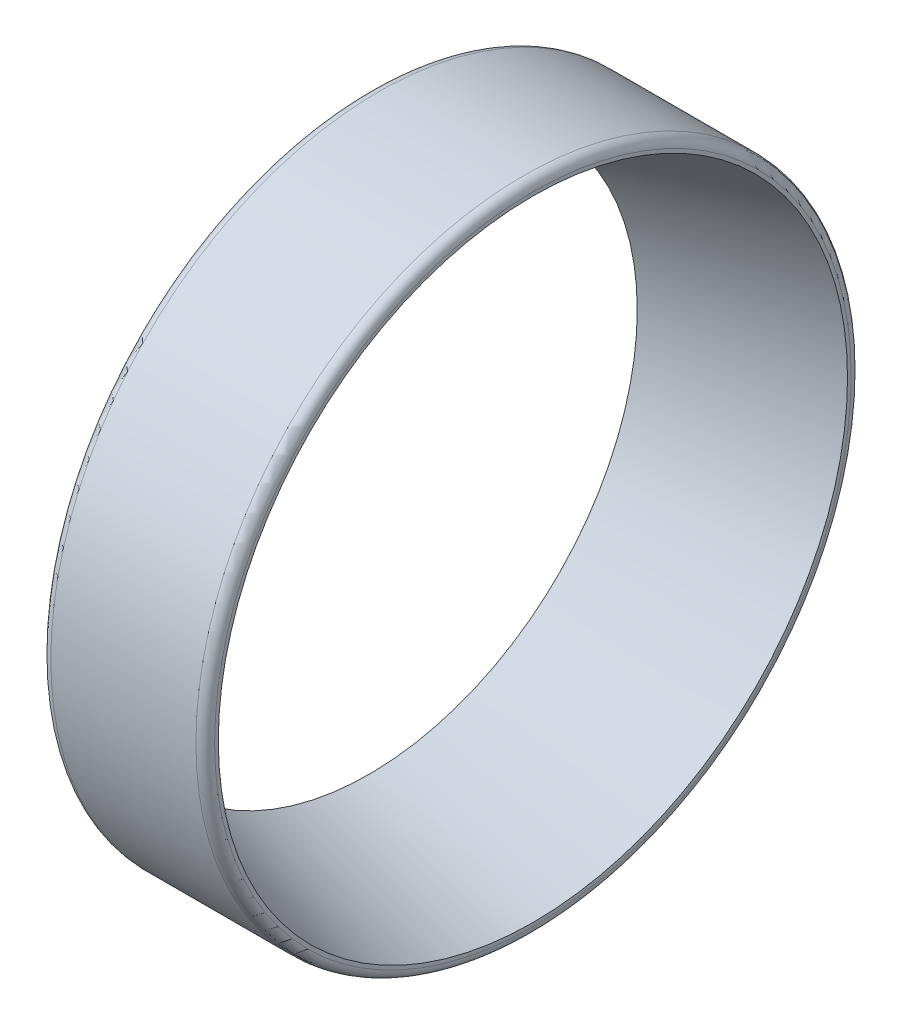
ISO-10303-21;
HEADER;
FILE_DESCRIPTION(('STEP AP214'),'2;1');
FILE_NAME('part.step','',(''),(''),'','','');
FILE_SCHEMA(('AUTOMOTIVE_DESIGN { 1 0 10303 214 1 1 1 1 }'));
ENDSEC;
DATA;
#1=APPLICATION_CONTEXT('core data for automotive mechanical design processes');
#2=APPLICATION_PROTOCOL_DEFINITION('international standard','automotive_design',2000,#1);
#3=PRODUCT_CONTEXT('',#1,'mechanical');
#4=PRODUCT('Part','Part','',(#3));
#5=PRODUCT_RELATED_PRODUCT_CATEGORY('part','',(#4));
#6=PRODUCT_DEFINITION_FORMATION('','',#4);
#7=PRODUCT_DEFINITION_CONTEXT('part definition',#1,'design');
#8=PRODUCT_DEFINITION('design','',#6,#7);
#9=PRODUCT_DEFINITION_SHAPE('','',#8);
#10=(LENGTH_UNIT() NAMED_UNIT(*) SI_UNIT(.MILLI.,.METRE.));
#11=(NAMED_UNIT(*) PLANE_ANGLE_UNIT() SI_UNIT($,.RADIAN.));
#12=(NAMED_UNIT(*) SI_UNIT($,.STERADIAN.) SOLID_ANGLE_UNIT());
#13=UNCERTAINTY_MEASURE_WITH_UNIT(LENGTH_MEASURE(1.E-05),#10,'distance_accuracy_value','');
#14=(GEOMETRIC_REPRESENTATION_CONTEXT(3) GLOBAL_UNCERTAINTY_ASSIGNED_CONTEXT((#13)) GLOBAL_UNIT_ASSIGNED_CONTEXT((#10,
#11,#12)) REPRESENTATION_CONTEXT('',''));
#15=CARTESIAN_POINT('',(0.,0.,0.));
#16=DIRECTION('',(0.,0.,1.));
#17=DIRECTION('',(1.,0.,0.));
#18=AXIS2_PLACEMENT_3D('',#15,#16,#17);
#19=CARTESIAN_POINT('',(-44.,0.,0.));
#20=DIRECTION('',(1.,0.,0.));
#21=DIRECTION('',(0.,0.,-1.));
#22=AXIS2_PLACEMENT_3D('',#19,#20,#21);
#23=TOROIDAL_SURFACE('',#22,68.,2.00000000000031);
#24=CARTESIAN_POINT('',(-46.,0.,0.));
#25=DIRECTION('',(1.,0.,0.));
#26=DIRECTION('',(0.,0.,-1.));
#27=AXIS2_PLACEMENT_3D('',#24,#25,#26);
#28=CIRCLE('',#27,67.9999988953022);
#29=CARTESIAN_POINT('',(-46.,0.,-67.9999988953022));
#30=VERTEX_POINT('',#29);
#31=EDGE_CURVE('E38',#30,#30,#28,.T.);
#32=ORIENTED_EDGE('',*,*,#31,.T.);
#33=EDGE_LOOP('',(#32));
#34=FACE_BOUND('',#33,.T.);
#35=CARTESIAN_POINT('',(-44.,0.,0.));
#36=DIRECTION('',(1.,0.,0.));
#37=DIRECTION('',(0.,0.,-1.));
#38=AXIS2_PLACEMENT_3D('',#35,#36,#37);
#39=CIRCLE('',#38,70.);
#40=CARTESIAN_POINT('',(-44.,0.,-70.));
#41=VERTEX_POINT('',#40);
#42=EDGE_CURVE('E35',#41,#41,#39,.T.);
#43=ORIENTED_EDGE('',*,*,#42,.F.);
#44=EDGE_LOOP('',(#43));
#45=FACE_BOUND('',#44,.T.);
#46=ADVANCED_FACE('F15',(#34,#45),#23,.T.);
#47=CARTESIAN_POINT('',(-46.,68.,0.));
#48=DIRECTION('',(-1.,0.,0.));
#49=DIRECTION('',(0.,0.,1.));
#50=AXIS2_PLACEMENT_3D('',#47,#48,#49);
#51=PLANE('',#50);
#52=CARTESIAN_POINT('',(-46.,0.,0.));
#53=DIRECTION('',(1.,0.,0.));
#54=DIRECTION('',(0.,0.,-1.));
#55=AXIS2_PLACEMENT_3D('',#52,#53,#54);
#56=CIRCLE('',#55,57.291);
#57=CARTESIAN_POINT('',(-46.,0.,-57.291));
#58=VERTEX_POINT('',#57);
#59=EDGE_CURVE('E30',#58,#58,#56,.T.);
#60=ORIENTED_EDGE('',*,*,#59,.T.);
#61=EDGE_LOOP('',(#60));
#62=FACE_BOUND('',#61,.T.);
#63=ORIENTED_EDGE('',*,*,#31,.F.);
#64=EDGE_LOOP('',(#63));
#65=FACE_BOUND('',#64,.T.);
#66=ADVANCED_FACE('F44',(#62,#65),#51,.T.);
#67=CARTESIAN_POINT('',(-11.,0.,0.));
#68=DIRECTION('',(1.,0.,0.));
#69=DIRECTION('',(0.,0.,-1.));
#70=AXIS2_PLACEMENT_3D('',#67,#68,#69);
#71=CYLINDRICAL_SURFACE('',#70,70.);
#72=ORIENTED_EDGE('',*,*,#42,.T.);
#73=EDGE_LOOP('',(#72));
#74=FACE_BOUND('',#73,.T.);
#75=CARTESIAN_POINT('',(-13.,0.,0.));
#76=DIRECTION('',(1.,0.,0.));
#77=DIRECTION('',(0.,0.,-1.));
#78=AXIS2_PLACEMENT_3D('',#75,#76,#77);
#79=CIRCLE('',#78,70.);
#80=CARTESIAN_POINT('',(-13.,0.,-70.));
#81=VERTEX_POINT('',#80);
#82=EDGE_CURVE('E26',#81,#81,#79,.T.);
#83=ORIENTED_EDGE('',*,*,#82,.F.);
#84=EDGE_LOOP('',(#83));
#85=FACE_BOUND('',#84,.T.);
#86=ADVANCED_FACE('F46',(#74,#85),#71,.T.);
#87=CARTESIAN_POINT('',(-46.,0.,0.));
#88=DIRECTION('',(1.,0.,0.));
#89=DIRECTION('',(0.,0.,-1.));
#90=AXIS2_PLACEMENT_3D('',#87,#88,#89);
#91=CONICAL_SURFACE('',#90,57.291,0.276343852216723);
#92=CARTESIAN_POINT('',(-11.,0.,0.));
#93=DIRECTION('',(1.,0.,0.));
#94=DIRECTION('',(0.,0.,-1.));
#95=AXIS2_PLACEMENT_3D('',#92,#93,#94);
#96=CIRCLE('',#95,67.2170000000001);
#97=CARTESIAN_POINT('',(-11.,0.,-67.2170000000001));
#98=VERTEX_POINT('',#97);
#99=EDGE_CURVE('E22',#98,#98,#96,.T.);
#100=ORIENTED_EDGE('',*,*,#99,.T.);
#101=EDGE_LOOP('',(#100));
#102=FACE_BOUND('',#101,.T.);
#103=ORIENTED_EDGE('',*,*,#59,.F.);
#104=EDGE_LOOP('',(#103));
#105=FACE_BOUND('',#104,.T.);
#106=ADVANCED_FACE('F54',(#102,#105),#91,.F.);
#107=CARTESIAN_POINT('',(-13.0000000000003,0.,0.));
#108=DIRECTION('',(1.,0.,0.));
#109=DIRECTION('',(0.,0.,-1.));
#110=AXIS2_PLACEMENT_3D('',#107,#108,#109);
#111=TOROIDAL_SURFACE('',#110,68.,2.00000000000031);
#112=ORIENTED_EDGE('',*,*,#82,.T.);
#113=EDGE_LOOP('',(#112));
#114=FACE_BOUND('',#113,.T.);
#115=CARTESIAN_POINT('',(-11.,0.,0.));
#116=DIRECTION('',(1.,0.,0.));
#117=DIRECTION('',(0.,0.,-1.));
#118=AXIS2_PLACEMENT_3D('',#115,#116,#117);
#119=CIRCLE('',#118,67.9999998023138);
#120=CARTESIAN_POINT('',(-11.,0.,-67.9999998023138));
#121=VERTEX_POINT('',#120);
#122=EDGE_CURVE('E10',#121,#121,#119,.T.);
#123=ORIENTED_EDGE('',*,*,#122,.F.);
#124=EDGE_LOOP('',(#123));
#125=FACE_BOUND('',#124,.T.);
#126=ADVANCED_FACE('F60',(#114,#125),#111,.T.);
#127=CARTESIAN_POINT('',(-11.,67.217,0.));
#128=DIRECTION('',(1.,0.,0.));
#129=DIRECTION('',(0.,0.,-1.));
#130=AXIS2_PLACEMENT_3D('',#127,#128,#129);
#131=PLANE('',#130);
#132=ORIENTED_EDGE('',*,*,#122,.T.);
#133=EDGE_LOOP('',(#132));
#134=FACE_BOUND('',#133,.T.);
#135=ORIENTED_EDGE('',*,*,#99,.F.);
#136=EDGE_LOOP('',(#135));
#137=FACE_BOUND('',#136,.T.);
#138=ADVANCED_FACE('F17',(#134,#137),#131,.T.);
#139=CLOSED_SHELL('',(#46,#66,#86,#106,#126,#138));
#140=MANIFOLD_SOLID_BREP('B1',#139);
#141=ADVANCED_BREP_SHAPE_REPRESENTATION('',(#18,#140),#14);
#142=SHAPE_DEFINITION_REPRESENTATION(#9,#141);
ENDSEC;
END-ISO-10303-21;
